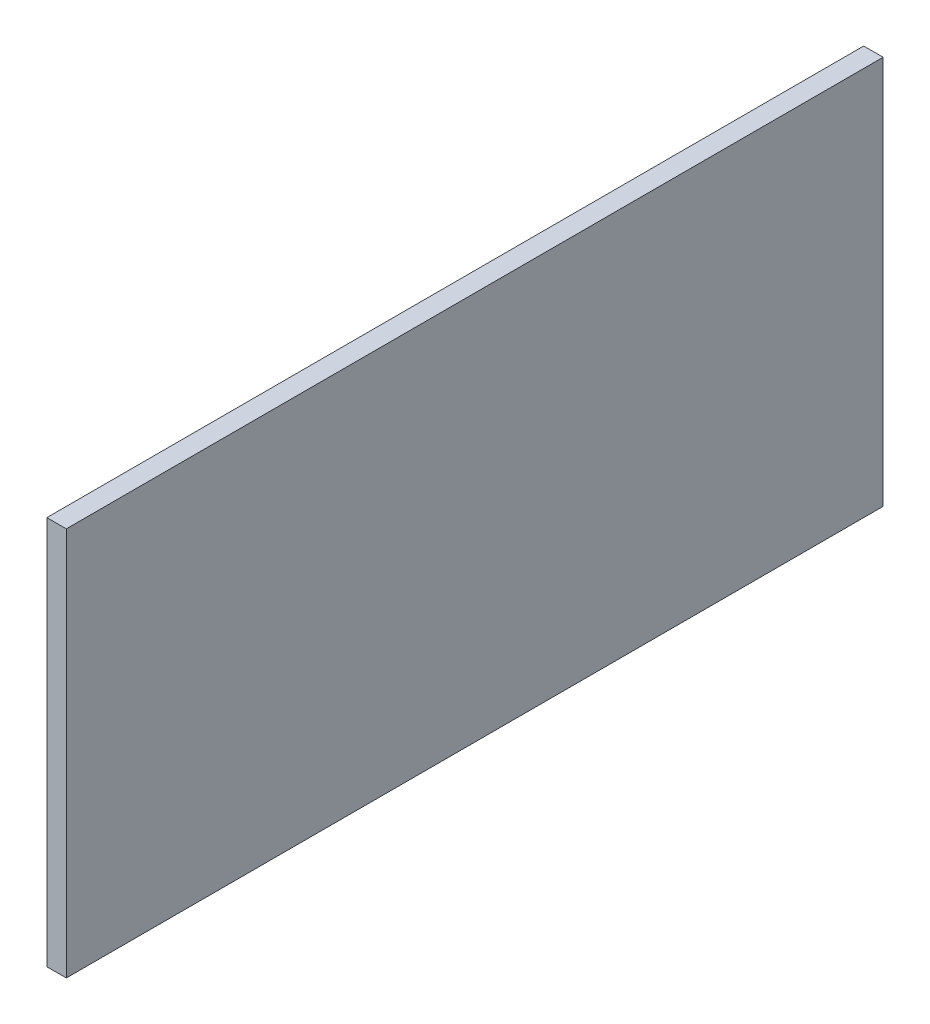
ISO-10303-21;
HEADER;
FILE_DESCRIPTION(('STEP AP214'),'2;1');
FILE_NAME('part.step','',(''),(''),'','','');
FILE_SCHEMA(('AUTOMOTIVE_DESIGN { 1 0 10303 214 1 1 1 1 }'));
ENDSEC;
DATA;
#1=APPLICATION_CONTEXT('core data for automotive mechanical design processes');
#2=APPLICATION_PROTOCOL_DEFINITION('international standard','automotive_design',2000,#1);
#3=PRODUCT_CONTEXT('',#1,'mechanical');
#4=PRODUCT('Part','Part','',(#3));
#5=PRODUCT_RELATED_PRODUCT_CATEGORY('part','',(#4));
#6=PRODUCT_DEFINITION_FORMATION('','',#4);
#7=PRODUCT_DEFINITION_CONTEXT('part definition',#1,'design');
#8=PRODUCT_DEFINITION('design','',#6,#7);
#9=PRODUCT_DEFINITION_SHAPE('','',#8);
#10=(LENGTH_UNIT() NAMED_UNIT(*) SI_UNIT(.MILLI.,.METRE.));
#11=(NAMED_UNIT(*) PLANE_ANGLE_UNIT() SI_UNIT($,.RADIAN.));
#12=(NAMED_UNIT(*) SI_UNIT($,.STERADIAN.) SOLID_ANGLE_UNIT());
#13=UNCERTAINTY_MEASURE_WITH_UNIT(LENGTH_MEASURE(1.E-05),#10,'distance_accuracy_value','');
#14=(GEOMETRIC_REPRESENTATION_CONTEXT(3) GLOBAL_UNCERTAINTY_ASSIGNED_CONTEXT((#13)) GLOBAL_UNIT_ASSIGNED_CONTEXT((#10,
#11,#12)) REPRESENTATION_CONTEXT('',''));
#15=CARTESIAN_POINT('',(0.,0.,0.));
#16=DIRECTION('',(0.,0.,1.));
#17=DIRECTION('',(1.,0.,0.));
#18=AXIS2_PLACEMENT_3D('',#15,#16,#17);
#19=CARTESIAN_POINT('',(5.,-52.6822580645162,-157.675089605735));
#20=DIRECTION('',(0.,0.,1.));
#21=DIRECTION('',(0.,-1.,0.));
#22=AXIS2_PLACEMENT_3D('',#19,#20,#21);
#23=PLANE('',#22);
#24=DIRECTION('',(0.,1.,0.));
#25=VECTOR('',#24,1.);
#26=CARTESIAN_POINT('',(0.,-52.6822580645162,-157.675089605735));
#27=LINE('',#26,#25);
#28=CARTESIAN_POINT('',(0.,-52.6822580645162,-157.675089605735));
#29=VERTEX_POINT('',#28);
#30=CARTESIAN_POINT('',(0.,47.3177419354839,-157.675089605735));
#31=VERTEX_POINT('',#30);
#32=EDGE_CURVE('E95',#29,#31,#27,.T.);
#33=ORIENTED_EDGE('',*,*,#32,.T.);
#34=DIRECTION('',(-1.,0.,0.));
#35=VECTOR('',#34,1.);
#36=CARTESIAN_POINT('',(5.,47.3177419354839,-157.675089605735));
#37=LINE('',#36,#35);
#38=CARTESIAN_POINT('',(5.,47.3177419354839,-157.675089605735));
#39=VERTEX_POINT('',#38);
#40=EDGE_CURVE('E11',#39,#31,#37,.T.);
#41=ORIENTED_EDGE('',*,*,#40,.F.);
#42=DIRECTION('',(0.,1.,0.));
#43=VECTOR('',#42,1.);
#44=CARTESIAN_POINT('',(5.,-52.6822580645162,-157.675089605735));
#45=LINE('',#44,#43);
#46=CARTESIAN_POINT('',(5.,-52.6822580645162,-157.675089605735));
#47=VERTEX_POINT('',#46);
#48=EDGE_CURVE('E83',#47,#39,#45,.T.);
#49=ORIENTED_EDGE('',*,*,#48,.F.);
#50=DIRECTION('',(-1.,0.,0.));
#51=VECTOR('',#50,1.);
#52=CARTESIAN_POINT('',(5.,-52.6822580645162,-157.675089605735));
#53=LINE('',#52,#51);
#54=EDGE_CURVE('E91',#47,#29,#53,.T.);
#55=ORIENTED_EDGE('',*,*,#54,.T.);
#56=EDGE_LOOP('',(#33,#41,#49,#55));
#57=FACE_BOUND('',#56,.T.);
#58=ADVANCED_FACE('F32',(#57),#23,.F.);
#59=CARTESIAN_POINT('',(5.,47.3177419354839,52.3249103942652));
#60=DIRECTION('',(0.,-1.,0.));
#61=DIRECTION('',(0.,0.,-1.));
#62=AXIS2_PLACEMENT_3D('',#59,#60,#61);
#63=PLANE('',#62);
#64=DIRECTION('',(0.,0.,1.));
#65=VECTOR('',#64,1.);
#66=CARTESIAN_POINT('',(0.,47.3177419354839,52.3249103942652));
#67=LINE('',#66,#65);
#68=CARTESIAN_POINT('',(0.,47.3177419354839,52.3249103942652));
#69=VERTEX_POINT('',#68);
#70=EDGE_CURVE('E87',#31,#69,#67,.T.);
#71=ORIENTED_EDGE('',*,*,#70,.T.);
#72=DIRECTION('',(-1.,0.,0.));
#73=VECTOR('',#72,1.);
#74=CARTESIAN_POINT('',(5.,47.3177419354839,52.3249103942652));
#75=LINE('',#74,#73);
#76=CARTESIAN_POINT('',(5.,47.3177419354839,52.3249103942652));
#77=VERTEX_POINT('',#76);
#78=EDGE_CURVE('E40',#77,#69,#75,.T.);
#79=ORIENTED_EDGE('',*,*,#78,.F.);
#80=DIRECTION('',(0.,0.,1.));
#81=VECTOR('',#80,1.);
#82=CARTESIAN_POINT('',(5.,47.3177419354839,52.3249103942652));
#83=LINE('',#82,#81);
#84=EDGE_CURVE('E78',#39,#77,#83,.T.);
#85=ORIENTED_EDGE('',*,*,#84,.F.);
#86=ORIENTED_EDGE('',*,*,#40,.T.);
#87=EDGE_LOOP('',(#71,#79,#85,#86));
#88=FACE_BOUND('',#87,.T.);
#89=ADVANCED_FACE('F86',(#88),#63,.F.);
#90=CARTESIAN_POINT('',(5.,-52.6822580645162,52.3249103942652));
#91=DIRECTION('',(0.,0.,-1.));
#92=DIRECTION('',(-1.,0.,0.));
#93=AXIS2_PLACEMENT_3D('',#90,#91,#92);
#94=PLANE('',#93);
#95=DIRECTION('',(0.,-1.,0.));
#96=VECTOR('',#95,1.);
#97=CARTESIAN_POINT('',(0.,-52.6822580645162,52.3249103942652));
#98=LINE('',#97,#96);
#99=CARTESIAN_POINT('',(0.,-52.6822580645162,52.3249103942652));
#100=VERTEX_POINT('',#99);
#101=EDGE_CURVE('E65',#69,#100,#98,.T.);
#102=ORIENTED_EDGE('',*,*,#101,.T.);
#103=DIRECTION('',(-1.,0.,0.));
#104=VECTOR('',#103,1.);
#105=CARTESIAN_POINT('',(5.,-52.6822580645162,52.3249103942652));
#106=LINE('',#105,#104);
#107=CARTESIAN_POINT('',(5.,-52.6822580645162,52.3249103942652));
#108=VERTEX_POINT('',#107);
#109=EDGE_CURVE('E88',#108,#100,#106,.T.);
#110=ORIENTED_EDGE('',*,*,#109,.F.);
#111=DIRECTION('',(0.,-1.,0.));
#112=VECTOR('',#111,1.);
#113=CARTESIAN_POINT('',(5.,-52.6822580645162,52.3249103942652));
#114=LINE('',#113,#112);
#115=EDGE_CURVE('E81',#77,#108,#114,.T.);
#116=ORIENTED_EDGE('',*,*,#115,.F.);
#117=ORIENTED_EDGE('',*,*,#78,.T.);
#118=EDGE_LOOP('',(#102,#110,#116,#117));
#119=FACE_BOUND('',#118,.T.);
#120=ADVANCED_FACE('F89',(#119),#94,.F.);
#121=CARTESIAN_POINT('',(5.,-52.6822580645162,52.3249103942652));
#122=DIRECTION('',(0.,1.,0.));
#123=DIRECTION('',(0.,0.,1.));
#124=AXIS2_PLACEMENT_3D('',#121,#122,#123);
#125=PLANE('',#124);
#126=DIRECTION('',(0.,0.,-1.));
#127=VECTOR('',#126,1.);
#128=CARTESIAN_POINT('',(0.,-52.6822580645162,52.3249103942652));
#129=LINE('',#128,#127);
#130=EDGE_CURVE('E71',#100,#29,#129,.T.);
#131=ORIENTED_EDGE('',*,*,#130,.T.);
#132=ORIENTED_EDGE('',*,*,#54,.F.);
#133=DIRECTION('',(0.,0.,-1.));
#134=VECTOR('',#133,1.);
#135=CARTESIAN_POINT('',(5.,-52.6822580645162,52.3249103942652));
#136=LINE('',#135,#134);
#137=EDGE_CURVE('E48',#108,#47,#136,.T.);
#138=ORIENTED_EDGE('',*,*,#137,.F.);
#139=ORIENTED_EDGE('',*,*,#109,.T.);
#140=EDGE_LOOP('',(#131,#132,#138,#139));
#141=FACE_BOUND('',#140,.T.);
#142=ADVANCED_FACE('F102',(#141),#125,.F.);
#143=CARTESIAN_POINT('',(5.,0.,0.));
#144=DIRECTION('',(-1.,0.,0.));
#145=DIRECTION('',(0.,0.,1.));
#146=AXIS2_PLACEMENT_3D('',#143,#144,#145);
#147=PLANE('',#146);
#148=ORIENTED_EDGE('',*,*,#48,.T.);
#149=ORIENTED_EDGE('',*,*,#84,.T.);
#150=ORIENTED_EDGE('',*,*,#115,.T.);
#151=ORIENTED_EDGE('',*,*,#137,.T.);
#152=EDGE_LOOP('',(#148,#149,#150,#151));
#153=FACE_BOUND('',#152,.T.);
#154=ADVANCED_FACE('F79',(#153),#147,.F.);
#155=CARTESIAN_POINT('',(0.,0.,0.));
#156=DIRECTION('',(-1.,0.,0.));
#157=DIRECTION('',(0.,0.,1.));
#158=AXIS2_PLACEMENT_3D('',#155,#156,#157);
#159=PLANE('',#158);
#160=ORIENTED_EDGE('',*,*,#32,.F.);
#161=ORIENTED_EDGE('',*,*,#130,.F.);
#162=ORIENTED_EDGE('',*,*,#101,.F.);
#163=ORIENTED_EDGE('',*,*,#70,.F.);
#164=EDGE_LOOP('',(#160,#161,#162,#163));
#165=FACE_BOUND('',#164,.T.);
#166=ADVANCED_FACE('F105',(#165),#159,.T.);
#167=CLOSED_SHELL('',(#58,#89,#120,#142,#154,#166));
#168=MANIFOLD_SOLID_BREP('B2',#167);
#169=ADVANCED_BREP_SHAPE_REPRESENTATION('',(#18,#168),#14);
#170=SHAPE_DEFINITION_REPRESENTATION(#9,#169);
ENDSEC;
END-ISO-10303-21;
